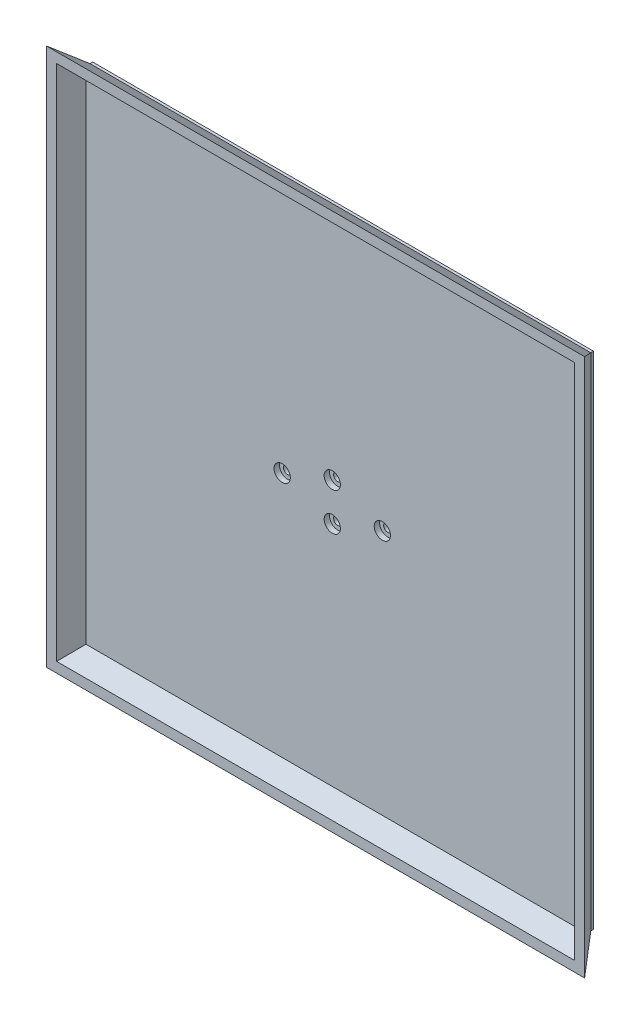
ISO-10303-21;
HEADER;
FILE_DESCRIPTION(('STEP AP214'),'2;1');
FILE_NAME('part.step','',(''),(''),'','','');
FILE_SCHEMA(('AUTOMOTIVE_DESIGN { 1 0 10303 214 1 1 1 1 }'));
ENDSEC;
DATA;
#1=APPLICATION_CONTEXT('core data for automotive mechanical design processes');
#2=APPLICATION_PROTOCOL_DEFINITION('international standard','automotive_design',2000,#1);
#3=PRODUCT_CONTEXT('',#1,'mechanical');
#4=PRODUCT('Part','Part','',(#3));
#5=PRODUCT_RELATED_PRODUCT_CATEGORY('part','',(#4));
#6=PRODUCT_DEFINITION_FORMATION('','',#4);
#7=PRODUCT_DEFINITION_CONTEXT('part definition',#1,'design');
#8=PRODUCT_DEFINITION('design','',#6,#7);
#9=PRODUCT_DEFINITION_SHAPE('','',#8);
#10=(LENGTH_UNIT() NAMED_UNIT(*) SI_UNIT(.MILLI.,.METRE.));
#11=(NAMED_UNIT(*) PLANE_ANGLE_UNIT() SI_UNIT($,.RADIAN.));
#12=(NAMED_UNIT(*) SI_UNIT($,.STERADIAN.) SOLID_ANGLE_UNIT());
#13=UNCERTAINTY_MEASURE_WITH_UNIT(LENGTH_MEASURE(1.E-05),#10,'distance_accuracy_value','');
#14=(GEOMETRIC_REPRESENTATION_CONTEXT(3) GLOBAL_UNCERTAINTY_ASSIGNED_CONTEXT((#13)) GLOBAL_UNIT_ASSIGNED_CONTEXT((#10,
#11,#12)) REPRESENTATION_CONTEXT('',''));
#15=CARTESIAN_POINT('',(0.,0.,0.));
#16=DIRECTION('',(0.,0.,1.));
#17=DIRECTION('',(1.,0.,0.));
#18=AXIS2_PLACEMENT_3D('',#15,#16,#17);
#19=CARTESIAN_POINT('',(0.,11.3214859008035,-8.36360928439204));
#20=DIRECTION('',(0.,-0.804327079908719,0.594186795987182));
#21=DIRECTION('',(0.,-0.594186795987182,-0.804327079908719));
#22=AXIS2_PLACEMENT_3D('',#19,#20,#21);
#23=PLANE('',#22);
#24=DIRECTION('',(0.515532809054974,-0.509140744837558,-0.689203616309537));
#25=VECTOR('',#24,1.);
#26=CARTESIAN_POINT('',(-32.460246779188,32.2747554652671,20.));
#27=LINE('',#26,#25);
#28=CARTESIAN_POINT('',(-24.374233395037,24.2890001362903,9.19000000000005));
#29=VERTEX_POINT('',#28);
#30=CARTESIAN_POINT('',(-17.4999999999999,17.5,0.));
#31=VERTEX_POINT('',#30);
#32=EDGE_CURVE('E187',#29,#31,#27,.T.);
#33=ORIENTED_EDGE('',*,*,#32,.F.);
#34=DIRECTION('',(1.,0.,0.));
#35=VECTOR('',#34,1.);
#36=CARTESIAN_POINT('',(0.,24.2890001362902,9.19));
#37=LINE('',#36,#35);
#38=CARTESIAN_POINT('',(174.410766604963,24.2890001362902,9.19000000000001));
#39=VERTEX_POINT('',#38);
#40=EDGE_CURVE('E528',#29,#39,#37,.T.);
#41=ORIENTED_EDGE('',*,*,#40,.T.);
#42=DIRECTION('',(-0.517540186366869,-0.508421221063519,-0.688229625537601));
#43=VECTOR('',#42,1.);
#44=CARTESIAN_POINT('',(182.539753220812,32.2747554652671,20.));
#45=LINE('',#44,#43);
#46=CARTESIAN_POINT('',(167.5,17.5,0.));
#47=VERTEX_POINT('',#46);
#48=EDGE_CURVE('E317',#39,#47,#45,.T.);
#49=ORIENTED_EDGE('',*,*,#48,.T.);
#50=DIRECTION('',(-1.,0.,0.));
#51=VECTOR('',#50,1.);
#52=CARTESIAN_POINT('',(-17.4999999999999,17.5,0.));
#53=LINE('',#52,#51);
#54=CARTESIAN_POINT('',(164.671572875254,17.5,0.));
#55=VERTEX_POINT('',#54);
#56=EDGE_CURVE('E464',#47,#55,#53,.T.);
#57=ORIENTED_EDGE('',*,*,#56,.T.);
#58=CARTESIAN_POINT('',(-14.6715728752536,17.5,0.));
#59=VERTEX_POINT('',#58);
#60=EDGE_CURVE('E410',#55,#59,#53,.T.);
#61=ORIENTED_EDGE('',*,*,#60,.T.);
#62=DIRECTION('',(-1.,0.,0.));
#63=VECTOR('',#62,1.);
#64=CARTESIAN_POINT('',(-14.6715728752538,17.5,0.));
#65=LINE('',#64,#63);
#66=EDGE_CURVE('E422',#59,#31,#65,.T.);
#67=ORIENTED_EDGE('',*,*,#66,.T.);
#68=EDGE_LOOP('',(#33,#41,#49,#57,#61,#67));
#69=FACE_BOUND('',#68,.T.);
#70=ADVANCED_FACE('F182',(#69),#23,.F.);
#71=CARTESIAN_POINT('',(-11.221383761654,0.,-8.39373351391584));
#72=DIRECTION('',(0.800763341591864,0.,0.598980860097075));
#73=DIRECTION('',(0.598980860097075,0.,-0.800763341591864));
#74=AXIS2_PLACEMENT_3D('',#71,#72,#73);
#75=PLANE('',#74);
#76=DIRECTION('',(0.,-1.,0.));
#77=VECTOR('',#76,1.);
#78=CARTESIAN_POINT('',(-24.374233395037,0.,9.19000000000001));
#79=LINE('',#78,#77);
#80=CARTESIAN_POINT('',(-24.3742333950368,-174.49599986371,9.19));
#81=VERTEX_POINT('',#80);
#82=EDGE_CURVE('E301',#29,#81,#79,.T.);
#83=ORIENTED_EDGE('',*,*,#82,.F.);
#84=ORIENTED_EDGE('',*,*,#32,.T.);
#85=DIRECTION('',(0.,-1.,0.));
#86=VECTOR('',#85,1.);
#87=CARTESIAN_POINT('',(-17.4999999999999,-167.5,0.));
#88=LINE('',#87,#86);
#89=CARTESIAN_POINT('',(-17.4999999999999,14.6715728752539,0.));
#90=VERTEX_POINT('',#89);
#91=EDGE_CURVE('E581',#31,#90,#88,.T.);
#92=ORIENTED_EDGE('',*,*,#91,.T.);
#93=CARTESIAN_POINT('',(-17.4999999999999,-164.67157287525,0.));
#94=VERTEX_POINT('',#93);
#95=EDGE_CURVE('E323',#90,#94,#88,.T.);
#96=ORIENTED_EDGE('',*,*,#95,.T.);
#97=CARTESIAN_POINT('',(-17.4999999999999,-167.5,0.));
#98=VERTEX_POINT('',#97);
#99=EDGE_CURVE('E405',#94,#98,#88,.T.);
#100=ORIENTED_EDGE('',*,*,#99,.T.);
#101=DIRECTION('',(0.511445122490861,0.520504585984007,-0.683738884845616));
#102=VECTOR('',#101,1.);
#103=CARTESIAN_POINT('',(-32.4602467791879,-182.725244534733,20.));
#104=LINE('',#103,#102);
#105=EDGE_CURVE('E321',#81,#98,#104,.T.);
#106=ORIENTED_EDGE('',*,*,#105,.F.);
#107=EDGE_LOOP('',(#83,#84,#92,#96,#100,#106));
#108=FACE_BOUND('',#107,.T.);
#109=ADVANCED_FACE('F382',(#108),#75,.F.);
#110=CARTESIAN_POINT('',(0.,-106.044862451429,-80.7279481237562));
#111=DIRECTION('',(0.,0.795678111064041,0.605719690594222));
#112=DIRECTION('',(0.,-0.605719690594222,0.795678111064041));
#113=AXIS2_PLACEMENT_3D('',#110,#111,#112);
#114=PLANE('',#113);
#115=DIRECTION('',(-1.,0.,0.));
#116=VECTOR('',#115,1.);
#117=CARTESIAN_POINT('',(0.,-174.49599986371,9.19));
#118=LINE('',#117,#116);
#119=CARTESIAN_POINT('',(174.410766604963,-174.49599986371,9.19000000000003));
#120=VERTEX_POINT('',#119);
#121=EDGE_CURVE('E526',#120,#81,#118,.T.);
#122=ORIENTED_EDGE('',*,*,#121,.T.);
#123=ORIENTED_EDGE('',*,*,#105,.T.);
#124=DIRECTION('',(1.,0.,0.));
#125=VECTOR('',#124,1.);
#126=CARTESIAN_POINT('',(-17.4999999999999,-167.5,0.));
#127=LINE('',#126,#125);
#128=CARTESIAN_POINT('',(-14.6715728752544,-167.5,0.));
#129=VERTEX_POINT('',#128);
#130=EDGE_CURVE('E193',#98,#129,#127,.T.);
#131=ORIENTED_EDGE('',*,*,#130,.T.);
#132=CARTESIAN_POINT('',(164.671572875254,-167.5,0.));
#133=VERTEX_POINT('',#132);
#134=EDGE_CURVE('E348',#129,#133,#127,.T.);
#135=ORIENTED_EDGE('',*,*,#134,.T.);
#136=DIRECTION('',(1.,0.,0.));
#137=VECTOR('',#136,1.);
#138=CARTESIAN_POINT('',(164.671572875254,-167.5,0.));
#139=LINE('',#138,#137);
#140=CARTESIAN_POINT('',(167.5,-167.5,0.));
#141=VERTEX_POINT('',#140);
#142=EDGE_CURVE('E353',#133,#141,#139,.T.);
#143=ORIENTED_EDGE('',*,*,#142,.T.);
#144=DIRECTION('',(-0.513448036426631,0.51978059717471,-0.682787847497552));
#145=VECTOR('',#144,1.);
#146=CARTESIAN_POINT('',(182.539753220812,-182.725244534733,20.));
#147=LINE('',#146,#145);
#148=EDGE_CURVE('E320',#120,#141,#147,.T.);
#149=ORIENTED_EDGE('',*,*,#148,.F.);
#150=EDGE_LOOP('',(#122,#123,#131,#135,#143,#149));
#151=FACE_BOUND('',#150,.T.);
#152=ADVANCED_FACE('F184',(#151),#114,.F.);
#153=CARTESIAN_POINT('',(0.,-103.657828118237,-78.9107890519735));
#154=DIRECTION('',(0.,0.795678111064041,0.605719690594222));
#155=DIRECTION('',(0.,-0.605719690594222,0.795678111064041));
#156=AXIS2_PLACEMENT_3D('',#153,#154,#155);
#157=PLANE('',#156);
#158=DIRECTION('',(0.51144512249086,0.520504585984007,-0.683738884845616));
#159=VECTOR('',#158,1.);
#160=CARTESIAN_POINT('',(33.4304203031569,-115.709844169123,-63.0791667441771));
#161=LINE('',#160,#159);
#162=CARTESIAN_POINT('',(-20.6278081478019,-170.725630969198,9.19000000000001));
#163=VERTEX_POINT('',#162);
#164=CARTESIAN_POINT('',(-15.9976117696432,-166.013417785698,3.));
#165=VERTEX_POINT('',#164);
#166=EDGE_CURVE('E209',#163,#165,#161,.T.);
#167=ORIENTED_EDGE('',*,*,#166,.F.);
#168=DIRECTION('',(-1.,0.,0.));
#169=VECTOR('',#168,1.);
#170=CARTESIAN_POINT('',(0.,-170.725630969198,9.19));
#171=LINE('',#170,#169);
#172=CARTESIAN_POINT('',(170.657185783772,-170.725630969198,9.19000000000002));
#173=VERTEX_POINT('',#172);
#174=EDGE_CURVE('E300',#173,#163,#171,.T.);
#175=ORIENTED_EDGE('',*,*,#174,.F.);
#176=DIRECTION('',(-0.513448036426631,0.51978059717471,-0.682787847497552));
#177=VECTOR('',#176,1.);
#178=CARTESIAN_POINT('',(76.8819155984242,-75.7937927321945,-115.513203315306));
#179=LINE('',#178,#177);
#180=CARTESIAN_POINT('',(166.002382161931,-166.013417785698,3.));
#181=VERTEX_POINT('',#180);
#182=EDGE_CURVE('E201',#173,#181,#179,.T.);
#183=ORIENTED_EDGE('',*,*,#182,.T.);
#184=DIRECTION('',(1.,0.,0.));
#185=VECTOR('',#184,1.);
#186=CARTESIAN_POINT('',(0.,-166.013417785698,3.));
#187=LINE('',#186,#185);
#188=EDGE_CURVE('E319',#165,#181,#187,.T.);
#189=ORIENTED_EDGE('',*,*,#188,.F.);
#190=EDGE_LOOP('',(#167,#175,#183,#189));
#191=FACE_BOUND('',#190,.T.);
#192=ADVANCED_FACE('F622',(#191),#157,.T.);
#193=CARTESIAN_POINT('',(-8.81909373687842,0.,-6.59679093362462));
#194=DIRECTION('',(0.800763341591864,0.,0.598980860097075));
#195=DIRECTION('',(0.598980860097075,0.,-0.800763341591864));
#196=AXIS2_PLACEMENT_3D('',#193,#194,#195);
#197=PLANE('',#196);
#198=DIRECTION('',(0.515532809054974,-0.509140744837558,-0.689203616309537));
#199=VECTOR('',#198,1.);
#200=CARTESIAN_POINT('',(-6.48385292214424,6.59058913702638,-9.71871913334237));
#201=LINE('',#200,#199);
#202=CARTESIAN_POINT('',(-20.627808147802,20.5591742048539,9.19000000000001));
#203=VERTEX_POINT('',#202);
#204=CARTESIAN_POINT('',(-15.9976117696433,15.9863873883537,3.));
#205=VERTEX_POINT('',#204);
#206=EDGE_CURVE('E292',#203,#205,#201,.T.);
#207=ORIENTED_EDGE('',*,*,#206,.F.);
#208=DIRECTION('',(0.,-1.,0.));
#209=VECTOR('',#208,1.);
#210=CARTESIAN_POINT('',(-20.627808147802,0.,9.19000000000001));
#211=LINE('',#210,#209);
#212=EDGE_CURVE('E297',#203,#163,#211,.T.);
#213=ORIENTED_EDGE('',*,*,#212,.T.);
#214=ORIENTED_EDGE('',*,*,#166,.T.);
#215=DIRECTION('',(0.,-1.,0.));
#216=VECTOR('',#215,1.);
#217=CARTESIAN_POINT('',(-15.9976117696433,0.,3.));
#218=LINE('',#217,#216);
#219=EDGE_CURVE('E305',#205,#165,#218,.T.);
#220=ORIENTED_EDGE('',*,*,#219,.F.);
#221=EDGE_LOOP('',(#207,#213,#214,#220));
#222=FACE_BOUND('',#221,.T.);
#223=ADVANCED_FACE('F303',(#222),#197,.T.);
#224=CARTESIAN_POINT('',(0.,8.90850466107736,-6.58104889643049));
#225=DIRECTION('',(0.,-0.804327079908719,0.594186795987182));
#226=DIRECTION('',(0.,-0.594186795987182,-0.804327079908719));
#227=AXIS2_PLACEMENT_3D('',#224,#225,#226);
#228=PLANE('',#227);
#229=DIRECTION('',(1.,0.,0.));
#230=VECTOR('',#229,1.);
#231=CARTESIAN_POINT('',(0.,20.5591742048539,9.19));
#232=LINE('',#231,#230);
#233=CARTESIAN_POINT('',(170.657185783772,20.5591742048539,9.19));
#234=VERTEX_POINT('',#233);
#235=EDGE_CURVE('E12',#203,#234,#232,.T.);
#236=ORIENTED_EDGE('',*,*,#235,.F.);
#237=ORIENTED_EDGE('',*,*,#206,.T.);
#238=DIRECTION('',(-1.,0.,0.));
#239=VECTOR('',#238,1.);
#240=CARTESIAN_POINT('',(0.,15.9863873883537,3.));
#241=LINE('',#240,#239);
#242=CARTESIAN_POINT('',(166.002382161931,15.9863873883537,3.));
#243=VERTEX_POINT('',#242);
#244=EDGE_CURVE('E509',#243,#205,#241,.T.);
#245=ORIENTED_EDGE('',*,*,#244,.F.);
#246=DIRECTION('',(-0.517540186366869,-0.508421221063519,-0.688229625537601));
#247=VECTOR('',#246,1.);
#248=CARTESIAN_POINT('',(116.263969700101,-32.8756431626005,-63.1425912135338));
#249=LINE('',#248,#247);
#250=EDGE_CURVE('E294',#234,#243,#249,.T.);
#251=ORIENTED_EDGE('',*,*,#250,.F.);
#252=EDGE_LOOP('',(#236,#237,#245,#251));
#253=FACE_BOUND('',#252,.T.);
#254=ADVANCED_FACE('F289',(#253),#228,.T.);
#255=CARTESIAN_POINT('',(56.5,-75.,9.));
#256=DIRECTION('',(0.,0.,-1.));
#257=DIRECTION('',(-1.,0.,0.));
#258=AXIS2_PLACEMENT_3D('',#255,#256,#257);
#259=CYLINDRICAL_SURFACE('',#258,1.51);
#260=CARTESIAN_POINT('',(56.5,-75.,-1.));
#261=DIRECTION('',(0.,0.,-1.));
#262=DIRECTION('',(-1.,0.,0.));
#263=AXIS2_PLACEMENT_3D('',#260,#261,#262);
#264=CIRCLE('',#263,1.51);
#265=CARTESIAN_POINT('',(54.99,-75.,-1.));
#266=VERTEX_POINT('',#265);
#267=EDGE_CURVE('E483',#266,#266,#264,.T.);
#268=ORIENTED_EDGE('',*,*,#267,.T.);
#269=EDGE_LOOP('',(#268));
#270=FACE_BOUND('',#269,.T.);
#271=CARTESIAN_POINT('',(56.5,-75.,1.));
#272=DIRECTION('',(0.,0.,1.));
#273=DIRECTION('',(1.,0.,0.));
#274=AXIS2_PLACEMENT_3D('',#271,#272,#273);
#275=CIRCLE('',#274,1.51);
#276=CARTESIAN_POINT('',(58.01,-75.,1.));
#277=VERTEX_POINT('',#276);
#278=EDGE_CURVE('E481',#277,#277,#275,.F.);
#279=ORIENTED_EDGE('',*,*,#278,.F.);
#280=EDGE_LOOP('',(#279));
#281=FACE_BOUND('',#280,.T.);
#282=ADVANCED_FACE('F661',(#270,#281),#259,.F.);
#283=CARTESIAN_POINT('',(75.,-82.,9.));
#284=DIRECTION('',(0.,0.,-1.));
#285=DIRECTION('',(-1.,0.,0.));
#286=AXIS2_PLACEMENT_3D('',#283,#284,#285);
#287=CYLINDRICAL_SURFACE('',#286,1.50999999999999);
#288=CARTESIAN_POINT('',(75.,-82.,-1.));
#289=DIRECTION('',(0.,0.,-1.));
#290=DIRECTION('',(-1.,0.,0.));
#291=AXIS2_PLACEMENT_3D('',#288,#289,#290);
#292=CIRCLE('',#291,1.50999999999999);
#293=CARTESIAN_POINT('',(73.49,-82.,-1.));
#294=VERTEX_POINT('',#293);
#295=EDGE_CURVE('E487',#294,#294,#292,.T.);
#296=ORIENTED_EDGE('',*,*,#295,.T.);
#297=EDGE_LOOP('',(#296));
#298=FACE_BOUND('',#297,.T.);
#299=CARTESIAN_POINT('',(75.,-82.,1.));
#300=DIRECTION('',(0.,0.,1.));
#301=DIRECTION('',(1.,0.,0.));
#302=AXIS2_PLACEMENT_3D('',#299,#300,#301);
#303=CIRCLE('',#302,1.50999999999999);
#304=CARTESIAN_POINT('',(76.51,-82.,1.));
#305=VERTEX_POINT('',#304);
#306=EDGE_CURVE('E478',#305,#305,#303,.F.);
#307=ORIENTED_EDGE('',*,*,#306,.F.);
#308=EDGE_LOOP('',(#307));
#309=FACE_BOUND('',#308,.T.);
#310=ADVANCED_FACE('F791',(#298,#309),#287,.F.);
#311=CARTESIAN_POINT('',(75.,-68.,9.));
#312=DIRECTION('',(0.,0.,-1.));
#313=DIRECTION('',(-1.,0.,0.));
#314=AXIS2_PLACEMENT_3D('',#311,#312,#313);
#315=CYLINDRICAL_SURFACE('',#314,1.50999999999999);
#316=CARTESIAN_POINT('',(75.,-68.,-1.));
#317=DIRECTION('',(0.,0.,-1.));
#318=DIRECTION('',(-1.,0.,0.));
#319=AXIS2_PLACEMENT_3D('',#316,#317,#318);
#320=CIRCLE('',#319,1.50999999999999);
#321=CARTESIAN_POINT('',(73.49,-68.,-1.));
#322=VERTEX_POINT('',#321);
#323=EDGE_CURVE('E492',#322,#322,#320,.T.);
#324=ORIENTED_EDGE('',*,*,#323,.T.);
#325=EDGE_LOOP('',(#324));
#326=FACE_BOUND('',#325,.T.);
#327=CARTESIAN_POINT('',(75.,-68.,1.));
#328=DIRECTION('',(0.,0.,1.));
#329=DIRECTION('',(1.,0.,0.));
#330=AXIS2_PLACEMENT_3D('',#327,#328,#329);
#331=CIRCLE('',#330,1.50999999999999);
#332=CARTESIAN_POINT('',(76.51,-68.,1.));
#333=VERTEX_POINT('',#332);
#334=EDGE_CURVE('E474',#333,#333,#331,.F.);
#335=ORIENTED_EDGE('',*,*,#334,.F.);
#336=EDGE_LOOP('',(#335));
#337=FACE_BOUND('',#336,.T.);
#338=ADVANCED_FACE('F558',(#326,#337),#315,.F.);
#339=CARTESIAN_POINT('',(93.5,-75.,9.));
#340=DIRECTION('',(0.,0.,-1.));
#341=DIRECTION('',(-1.,0.,0.));
#342=AXIS2_PLACEMENT_3D('',#339,#340,#341);
#343=CYLINDRICAL_SURFACE('',#342,1.50999999999999);
#344=CARTESIAN_POINT('',(93.5,-75.,-1.));
#345=DIRECTION('',(0.,0.,-1.));
#346=DIRECTION('',(-1.,0.,0.));
#347=AXIS2_PLACEMENT_3D('',#344,#345,#346);
#348=CIRCLE('',#347,1.50999999999999);
#349=CARTESIAN_POINT('',(91.99,-75.,-1.));
#350=VERTEX_POINT('',#349);
#351=EDGE_CURVE('E500',#350,#350,#348,.T.);
#352=ORIENTED_EDGE('',*,*,#351,.T.);
#353=EDGE_LOOP('',(#352));
#354=FACE_BOUND('',#353,.T.);
#355=CARTESIAN_POINT('',(93.5,-75.,1.));
#356=DIRECTION('',(0.,0.,1.));
#357=DIRECTION('',(1.,0.,0.));
#358=AXIS2_PLACEMENT_3D('',#355,#356,#357);
#359=CIRCLE('',#358,1.50999999999999);
#360=CARTESIAN_POINT('',(95.01,-75.,1.));
#361=VERTEX_POINT('',#360);
#362=EDGE_CURVE('E471',#361,#361,#359,.F.);
#363=ORIENTED_EDGE('',*,*,#362,.F.);
#364=EDGE_LOOP('',(#363));
#365=FACE_BOUND('',#364,.T.);
#366=ADVANCED_FACE('F381',(#354,#365),#343,.F.);
#367=CARTESIAN_POINT('',(106.995565380524,0.,-80.4593449522167));
#368=DIRECTION('',(-0.799236820228583,0.,0.601016227061219));
#369=DIRECTION('',(0.601016227061219,0.,0.799236820228583));
#370=AXIS2_PLACEMENT_3D('',#367,#368,#369);
#371=PLANE('',#370);
#372=ORIENTED_EDGE('',*,*,#48,.F.);
#373=DIRECTION('',(0.,-1.,0.));
#374=VECTOR('',#373,1.);
#375=CARTESIAN_POINT('',(174.410766604963,1.37354571998003E-13,9.19));
#376=LINE('',#375,#374);
#377=EDGE_CURVE('E519',#39,#120,#376,.T.);
#378=ORIENTED_EDGE('',*,*,#377,.T.);
#379=ORIENTED_EDGE('',*,*,#148,.T.);
#380=DIRECTION('',(0.,1.,0.));
#381=VECTOR('',#380,1.);
#382=CARTESIAN_POINT('',(167.5,-167.5,0.));
#383=LINE('',#382,#381);
#384=CARTESIAN_POINT('',(167.5,-164.671572875254,0.));
#385=VERTEX_POINT('',#384);
#386=EDGE_CURVE('E589',#141,#385,#383,.T.);
#387=ORIENTED_EDGE('',*,*,#386,.T.);
#388=CARTESIAN_POINT('',(167.5,14.6715728752538,0.));
#389=VERTEX_POINT('',#388);
#390=EDGE_CURVE('E360',#385,#389,#383,.T.);
#391=ORIENTED_EDGE('',*,*,#390,.T.);
#392=EDGE_CURVE('E308',#389,#47,#383,.T.);
#393=ORIENTED_EDGE('',*,*,#392,.T.);
#394=EDGE_LOOP('',(#372,#378,#379,#387,#391,#393));
#395=FACE_BOUND('',#394,.T.);
#396=ADVANCED_FACE('F371',(#395),#371,.F.);
#397=CARTESIAN_POINT('',(0.,0.,3.));
#398=DIRECTION('',(0.,0.,-1.));
#399=DIRECTION('',(-1.,0.,0.));
#400=AXIS2_PLACEMENT_3D('',#397,#398,#399);
#401=PLANE('',#400);
#402=CARTESIAN_POINT('',(75.,-68.,3.));
#403=DIRECTION('',(0.,0.,1.));
#404=DIRECTION('',(1.,0.,0.));
#405=AXIS2_PLACEMENT_3D('',#402,#403,#404);
#406=CIRCLE('',#405,3.00000000000001);
#407=CARTESIAN_POINT('',(78.,-68.,3.));
#408=VERTEX_POINT('',#407);
#409=EDGE_CURVE('E534',#408,#408,#406,.T.);
#410=ORIENTED_EDGE('',*,*,#409,.F.);
#411=EDGE_LOOP('',(#410));
#412=FACE_BOUND('',#411,.T.);
#413=CARTESIAN_POINT('',(75.,-82.,3.));
#414=DIRECTION('',(0.,0.,1.));
#415=DIRECTION('',(1.,0.,0.));
#416=AXIS2_PLACEMENT_3D('',#413,#414,#415);
#417=CIRCLE('',#416,3.00000000000001);
#418=CARTESIAN_POINT('',(78.,-82.,3.));
#419=VERTEX_POINT('',#418);
#420=EDGE_CURVE('E540',#419,#419,#417,.T.);
#421=ORIENTED_EDGE('',*,*,#420,.F.);
#422=EDGE_LOOP('',(#421));
#423=FACE_BOUND('',#422,.T.);
#424=CARTESIAN_POINT('',(93.5,-75.,3.));
#425=DIRECTION('',(0.,0.,1.));
#426=DIRECTION('',(1.,0.,0.));
#427=AXIS2_PLACEMENT_3D('',#424,#425,#426);
#428=CIRCLE('',#427,3.00000000000001);
#429=CARTESIAN_POINT('',(96.5,-75.,3.));
#430=VERTEX_POINT('',#429);
#431=EDGE_CURVE('E546',#430,#430,#428,.T.);
#432=ORIENTED_EDGE('',*,*,#431,.F.);
#433=EDGE_LOOP('',(#432));
#434=FACE_BOUND('',#433,.T.);
#435=CARTESIAN_POINT('',(56.5,-75.,3.));
#436=DIRECTION('',(0.,0.,1.));
#437=DIRECTION('',(1.,0.,0.));
#438=AXIS2_PLACEMENT_3D('',#435,#436,#437);
#439=CIRCLE('',#438,3.);
#440=CARTESIAN_POINT('',(59.5,-75.,3.));
#441=VERTEX_POINT('',#440);
#442=EDGE_CURVE('E531',#441,#441,#439,.T.);
#443=ORIENTED_EDGE('',*,*,#442,.F.);
#444=EDGE_LOOP('',(#443));
#445=FACE_BOUND('',#444,.T.);
#446=ORIENTED_EDGE('',*,*,#219,.T.);
#447=ORIENTED_EDGE('',*,*,#188,.T.);
#448=DIRECTION('',(0.,1.,0.));
#449=VECTOR('',#448,1.);
#450=CARTESIAN_POINT('',(166.002382161931,1.30732675489841E-13,3.));
#451=LINE('',#450,#449);
#452=EDGE_CURVE('E511',#181,#243,#451,.T.);
#453=ORIENTED_EDGE('',*,*,#452,.T.);
#454=ORIENTED_EDGE('',*,*,#244,.T.);
#455=EDGE_LOOP('',(#446,#447,#453,#454));
#456=FACE_BOUND('',#455,.T.);
#457=ADVANCED_FACE('F380',(#412,#423,#434,#445,#456),#401,.F.);
#458=CARTESIAN_POINT('',(104.597854919838,0.,-78.6562962710331));
#459=DIRECTION('',(-0.799236820228583,0.,0.601016227061219));
#460=DIRECTION('',(0.601016227061219,0.,0.799236820228583));
#461=AXIS2_PLACEMENT_3D('',#458,#459,#460);
#462=PLANE('',#461);
#463=DIRECTION('',(0.,-1.,0.));
#464=VECTOR('',#463,1.);
#465=CARTESIAN_POINT('',(170.657185783772,1.3439849596445E-13,9.19));
#466=LINE('',#465,#464);
#467=EDGE_CURVE('E517',#234,#173,#466,.T.);
#468=ORIENTED_EDGE('',*,*,#467,.F.);
#469=ORIENTED_EDGE('',*,*,#250,.T.);
#470=ORIENTED_EDGE('',*,*,#452,.F.);
#471=ORIENTED_EDGE('',*,*,#182,.F.);
#472=EDGE_LOOP('',(#468,#469,#470,#471));
#473=FACE_BOUND('',#472,.T.);
#474=ADVANCED_FACE('F516',(#473),#462,.T.);
#475=CARTESIAN_POINT('',(0.,0.,-1.));
#476=DIRECTION('',(0.,0.,-1.));
#477=DIRECTION('',(-1.,0.,0.));
#478=AXIS2_PLACEMENT_3D('',#475,#476,#477);
#479=PLANE('',#478);
#480=ORIENTED_EDGE('',*,*,#351,.F.);
#481=EDGE_LOOP('',(#480));
#482=FACE_BOUND('',#481,.T.);
#483=ORIENTED_EDGE('',*,*,#323,.F.);
#484=EDGE_LOOP('',(#483));
#485=FACE_BOUND('',#484,.T.);
#486=ORIENTED_EDGE('',*,*,#295,.F.);
#487=EDGE_LOOP('',(#486));
#488=FACE_BOUND('',#487,.T.);
#489=ORIENTED_EDGE('',*,*,#267,.F.);
#490=EDGE_LOOP('',(#489));
#491=FACE_BOUND('',#490,.T.);
#492=DIRECTION('',(1.,0.,0.));
#493=VECTOR('',#492,1.);
#494=CARTESIAN_POINT('',(-17.4999999999999,-167.5,-1.));
#495=LINE('',#494,#493);
#496=CARTESIAN_POINT('',(-17.4999999999999,-167.5,-1.));
#497=VERTEX_POINT('',#496);
#498=CARTESIAN_POINT('',(167.5,-167.5,-1.));
#499=VERTEX_POINT('',#498);
#500=EDGE_CURVE('E496',#497,#499,#495,.T.);
#501=ORIENTED_EDGE('',*,*,#500,.F.);
#502=DIRECTION('',(0.,-1.,0.));
#503=VECTOR('',#502,1.);
#504=CARTESIAN_POINT('',(-17.4999999999999,17.5,-1.));
#505=LINE('',#504,#503);
#506=CARTESIAN_POINT('',(-17.4999999999999,17.5,-1.));
#507=VERTEX_POINT('',#506);
#508=EDGE_CURVE('E504',#507,#497,#505,.T.);
#509=ORIENTED_EDGE('',*,*,#508,.F.);
#510=DIRECTION('',(1.,0.,0.));
#511=VECTOR('',#510,1.);
#512=CARTESIAN_POINT('',(-17.4999999999999,17.5,-1.));
#513=LINE('',#512,#511);
#514=CARTESIAN_POINT('',(167.5,17.5,-1.));
#515=VERTEX_POINT('',#514);
#516=EDGE_CURVE('E502',#507,#515,#513,.T.);
#517=ORIENTED_EDGE('',*,*,#516,.T.);
#518=DIRECTION('',(0.,-1.,0.));
#519=VECTOR('',#518,1.);
#520=CARTESIAN_POINT('',(167.5,17.5,-1.));
#521=LINE('',#520,#519);
#522=EDGE_CURVE('E499',#515,#499,#521,.T.);
#523=ORIENTED_EDGE('',*,*,#522,.T.);
#524=EDGE_LOOP('',(#501,#509,#517,#523));
#525=FACE_BOUND('',#524,.T.);
#526=ADVANCED_FACE('F561',(#482,#485,#488,#491,#525),#479,.T.);
#527=CARTESIAN_POINT('',(-17.4999999999999,-167.5,-1.));
#528=DIRECTION('',(0.,-1.,0.));
#529=DIRECTION('',(0.,0.,-1.));
#530=AXIS2_PLACEMENT_3D('',#527,#528,#529);
#531=PLANE('',#530);
#532=ORIENTED_EDGE('',*,*,#130,.F.);
#533=DIRECTION('',(0.,0.,1.));
#534=VECTOR('',#533,1.);
#535=CARTESIAN_POINT('',(-17.4999999999999,-167.5,-1.));
#536=LINE('',#535,#534);
#537=EDGE_CURVE('E430',#497,#98,#536,.T.);
#538=ORIENTED_EDGE('',*,*,#537,.F.);
#539=ORIENTED_EDGE('',*,*,#500,.T.);
#540=DIRECTION('',(0.,0.,1.));
#541=VECTOR('',#540,1.);
#542=CARTESIAN_POINT('',(167.5,-167.5,-1.));
#543=LINE('',#542,#541);
#544=EDGE_CURVE('E507',#499,#141,#543,.T.);
#545=ORIENTED_EDGE('',*,*,#544,.T.);
#546=ORIENTED_EDGE('',*,*,#142,.F.);
#547=ORIENTED_EDGE('',*,*,#134,.F.);
#548=EDGE_LOOP('',(#532,#538,#539,#545,#546,#547));
#549=FACE_BOUND('',#548,.T.);
#550=ADVANCED_FACE('F564',(#549),#531,.T.);
#551=CARTESIAN_POINT('',(-17.4999999999999,17.5,-1.));
#552=DIRECTION('',(-1.,0.,0.));
#553=DIRECTION('',(0.,0.,1.));
#554=AXIS2_PLACEMENT_3D('',#551,#552,#553);
#555=PLANE('',#554);
#556=ORIENTED_EDGE('',*,*,#91,.F.);
#557=DIRECTION('',(0.,0.,1.));
#558=VECTOR('',#557,1.);
#559=CARTESIAN_POINT('',(-17.4999999999999,17.5,-1.));
#560=LINE('',#559,#558);
#561=EDGE_CURVE('E579',#507,#31,#560,.T.);
#562=ORIENTED_EDGE('',*,*,#561,.F.);
#563=ORIENTED_EDGE('',*,*,#508,.T.);
#564=ORIENTED_EDGE('',*,*,#537,.T.);
#565=ORIENTED_EDGE('',*,*,#99,.F.);
#566=ORIENTED_EDGE('',*,*,#95,.F.);
#567=EDGE_LOOP('',(#556,#562,#563,#564,#565,#566));
#568=FACE_BOUND('',#567,.T.);
#569=ADVANCED_FACE('F453',(#568),#555,.T.);
#570=CARTESIAN_POINT('',(-17.4999999999999,17.5,-1.));
#571=DIRECTION('',(0.,-1.,0.));
#572=DIRECTION('',(0.,0.,-1.));
#573=AXIS2_PLACEMENT_3D('',#570,#571,#572);
#574=PLANE('',#573);
#575=ORIENTED_EDGE('',*,*,#66,.F.);
#576=ORIENTED_EDGE('',*,*,#60,.F.);
#577=ORIENTED_EDGE('',*,*,#56,.F.);
#578=DIRECTION('',(0.,0.,1.));
#579=VECTOR('',#578,1.);
#580=CARTESIAN_POINT('',(167.5,17.5,-1.));
#581=LINE('',#580,#579);
#582=EDGE_CURVE('E583',#515,#47,#581,.T.);
#583=ORIENTED_EDGE('',*,*,#582,.F.);
#584=ORIENTED_EDGE('',*,*,#516,.F.);
#585=ORIENTED_EDGE('',*,*,#561,.T.);
#586=EDGE_LOOP('',(#575,#576,#577,#583,#584,#585));
#587=FACE_BOUND('',#586,.T.);
#588=ADVANCED_FACE('F442',(#587),#574,.F.);
#589=CARTESIAN_POINT('',(167.5,17.5,-1.));
#590=DIRECTION('',(-1.,0.,0.));
#591=DIRECTION('',(0.,0.,1.));
#592=AXIS2_PLACEMENT_3D('',#589,#590,#591);
#593=PLANE('',#592);
#594=ORIENTED_EDGE('',*,*,#392,.F.);
#595=ORIENTED_EDGE('',*,*,#390,.F.);
#596=ORIENTED_EDGE('',*,*,#386,.F.);
#597=ORIENTED_EDGE('',*,*,#544,.F.);
#598=ORIENTED_EDGE('',*,*,#522,.F.);
#599=ORIENTED_EDGE('',*,*,#582,.T.);
#600=EDGE_LOOP('',(#594,#595,#596,#597,#598,#599));
#601=FACE_BOUND('',#600,.T.);
#602=ADVANCED_FACE('F452',(#601),#593,.F.);
#603=CARTESIAN_POINT('',(93.5,-75.,1.));
#604=DIRECTION('',(0.,0.,1.));
#605=DIRECTION('',(1.,0.,0.));
#606=AXIS2_PLACEMENT_3D('',#603,#604,#605);
#607=PLANE('',#606);
#608=CARTESIAN_POINT('',(93.5,-75.,1.));
#609=DIRECTION('',(0.,0.,1.));
#610=DIRECTION('',(1.,0.,0.));
#611=AXIS2_PLACEMENT_3D('',#608,#609,#610);
#612=CIRCLE('',#611,3.00000000000001);
#613=CARTESIAN_POINT('',(96.5,-75.,1.));
#614=VERTEX_POINT('',#613);
#615=EDGE_CURVE('E543',#614,#614,#612,.T.);
#616=ORIENTED_EDGE('',*,*,#615,.T.);
#617=EDGE_LOOP('',(#616));
#618=FACE_BOUND('',#617,.T.);
#619=ORIENTED_EDGE('',*,*,#362,.T.);
#620=EDGE_LOOP('',(#619));
#621=FACE_BOUND('',#620,.T.);
#622=ADVANCED_FACE('F730',(#618,#621),#607,.T.);
#623=CARTESIAN_POINT('',(93.5,-75.,1.));
#624=DIRECTION('',(0.,0.,1.));
#625=DIRECTION('',(1.,0.,0.));
#626=AXIS2_PLACEMENT_3D('',#623,#624,#625);
#627=CYLINDRICAL_SURFACE('',#626,3.00000000000001);
#628=ORIENTED_EDGE('',*,*,#615,.F.);
#629=EDGE_LOOP('',(#628));
#630=FACE_BOUND('',#629,.T.);
#631=ORIENTED_EDGE('',*,*,#431,.T.);
#632=EDGE_LOOP('',(#631));
#633=FACE_BOUND('',#632,.T.);
#634=ADVANCED_FACE('F722',(#630,#633),#627,.F.);
#635=CARTESIAN_POINT('',(75.,-68.,1.));
#636=DIRECTION('',(0.,0.,1.));
#637=DIRECTION('',(1.,0.,0.));
#638=AXIS2_PLACEMENT_3D('',#635,#636,#637);
#639=PLANE('',#638);
#640=CARTESIAN_POINT('',(75.,-68.,1.));
#641=DIRECTION('',(0.,0.,1.));
#642=DIRECTION('',(1.,0.,0.));
#643=AXIS2_PLACEMENT_3D('',#640,#641,#642);
#644=CIRCLE('',#643,3.00000000000001);
#645=CARTESIAN_POINT('',(78.,-68.,1.));
#646=VERTEX_POINT('',#645);
#647=EDGE_CURVE('E475',#646,#646,#644,.T.);
#648=ORIENTED_EDGE('',*,*,#647,.T.);
#649=EDGE_LOOP('',(#648));
#650=FACE_BOUND('',#649,.T.);
#651=ORIENTED_EDGE('',*,*,#334,.T.);
#652=EDGE_LOOP('',(#651));
#653=FACE_BOUND('',#652,.T.);
#654=ADVANCED_FACE('F714',(#650,#653),#639,.T.);
#655=CARTESIAN_POINT('',(75.,-68.,1.));
#656=DIRECTION('',(0.,0.,1.));
#657=DIRECTION('',(1.,0.,0.));
#658=AXIS2_PLACEMENT_3D('',#655,#656,#657);
#659=CYLINDRICAL_SURFACE('',#658,3.00000000000001);
#660=ORIENTED_EDGE('',*,*,#647,.F.);
#661=EDGE_LOOP('',(#660));
#662=FACE_BOUND('',#661,.T.);
#663=ORIENTED_EDGE('',*,*,#409,.T.);
#664=EDGE_LOOP('',(#663));
#665=FACE_BOUND('',#664,.T.);
#666=ADVANCED_FACE('F706',(#662,#665),#659,.F.);
#667=CARTESIAN_POINT('',(75.,-82.,1.));
#668=DIRECTION('',(0.,0.,1.));
#669=DIRECTION('',(1.,0.,0.));
#670=AXIS2_PLACEMENT_3D('',#667,#668,#669);
#671=PLANE('',#670);
#672=CARTESIAN_POINT('',(75.,-82.,1.));
#673=DIRECTION('',(0.,0.,1.));
#674=DIRECTION('',(1.,0.,0.));
#675=AXIS2_PLACEMENT_3D('',#672,#673,#674);
#676=CIRCLE('',#675,3.00000000000001);
#677=CARTESIAN_POINT('',(78.,-82.,1.));
#678=VERTEX_POINT('',#677);
#679=EDGE_CURVE('E537',#678,#678,#676,.T.);
#680=ORIENTED_EDGE('',*,*,#679,.T.);
#681=EDGE_LOOP('',(#680));
#682=FACE_BOUND('',#681,.T.);
#683=ORIENTED_EDGE('',*,*,#306,.T.);
#684=EDGE_LOOP('',(#683));
#685=FACE_BOUND('',#684,.T.);
#686=ADVANCED_FACE('F698',(#682,#685),#671,.T.);
#687=CARTESIAN_POINT('',(75.,-82.,1.));
#688=DIRECTION('',(0.,0.,1.));
#689=DIRECTION('',(1.,0.,0.));
#690=AXIS2_PLACEMENT_3D('',#687,#688,#689);
#691=CYLINDRICAL_SURFACE('',#690,3.00000000000001);
#692=ORIENTED_EDGE('',*,*,#679,.F.);
#693=EDGE_LOOP('',(#692));
#694=FACE_BOUND('',#693,.T.);
#695=ORIENTED_EDGE('',*,*,#420,.T.);
#696=EDGE_LOOP('',(#695));
#697=FACE_BOUND('',#696,.T.);
#698=ADVANCED_FACE('F690',(#694,#697),#691,.F.);
#699=CARTESIAN_POINT('',(56.5,-75.,1.));
#700=DIRECTION('',(0.,0.,1.));
#701=DIRECTION('',(1.,0.,0.));
#702=AXIS2_PLACEMENT_3D('',#699,#700,#701);
#703=PLANE('',#702);
#704=CARTESIAN_POINT('',(56.5,-75.,1.));
#705=DIRECTION('',(0.,0.,1.));
#706=DIRECTION('',(1.,0.,0.));
#707=AXIS2_PLACEMENT_3D('',#704,#705,#706);
#708=CIRCLE('',#707,3.);
#709=CARTESIAN_POINT('',(59.5,-75.,1.));
#710=VERTEX_POINT('',#709);
#711=EDGE_CURVE('E549',#710,#710,#708,.T.);
#712=ORIENTED_EDGE('',*,*,#711,.T.);
#713=EDGE_LOOP('',(#712));
#714=FACE_BOUND('',#713,.T.);
#715=ORIENTED_EDGE('',*,*,#278,.T.);
#716=EDGE_LOOP('',(#715));
#717=FACE_BOUND('',#716,.T.);
#718=ADVANCED_FACE('F681',(#714,#717),#703,.T.);
#719=CARTESIAN_POINT('',(56.5,-75.,1.));
#720=DIRECTION('',(0.,0.,1.));
#721=DIRECTION('',(1.,0.,0.));
#722=AXIS2_PLACEMENT_3D('',#719,#720,#721);
#723=CYLINDRICAL_SURFACE('',#722,3.);
#724=ORIENTED_EDGE('',*,*,#711,.F.);
#725=EDGE_LOOP('',(#724));
#726=FACE_BOUND('',#725,.T.);
#727=ORIENTED_EDGE('',*,*,#442,.T.);
#728=EDGE_LOOP('',(#727));
#729=FACE_BOUND('',#728,.T.);
#730=ADVANCED_FACE('F671',(#726,#729),#723,.F.);
#731=CARTESIAN_POINT('',(182.5,0.,9.19));
#732=DIRECTION('',(0.,0.,-1.));
#733=DIRECTION('',(-1.,0.,0.));
#734=AXIS2_PLACEMENT_3D('',#731,#732,#733);
#735=PLANE('',#734);
#736=ORIENTED_EDGE('',*,*,#212,.F.);
#737=ORIENTED_EDGE('',*,*,#235,.T.);
#738=ORIENTED_EDGE('',*,*,#467,.T.);
#739=ORIENTED_EDGE('',*,*,#174,.T.);
#740=EDGE_LOOP('',(#736,#737,#738,#739));
#741=FACE_BOUND('',#740,.T.);
#742=ORIENTED_EDGE('',*,*,#40,.F.);
#743=ORIENTED_EDGE('',*,*,#82,.T.);
#744=ORIENTED_EDGE('',*,*,#121,.F.);
#745=ORIENTED_EDGE('',*,*,#377,.F.);
#746=EDGE_LOOP('',(#742,#743,#744,#745));
#747=FACE_BOUND('',#746,.T.);
#748=ADVANCED_FACE('F298',(#741,#747),#735,.F.);
#749=CLOSED_SHELL('',(#70,#109,#152,#192,#223,#254,#282,#310,#338,#366,#396,#457,#474,#526,#550,
#569,#588,#602,#622,#634,#654,#666,#686,#698,#718,#730,#748));
#750=MANIFOLD_SOLID_BREP('B2',#749);
#751=ADVANCED_BREP_SHAPE_REPRESENTATION('',(#18,#750),#14);
#752=SHAPE_DEFINITION_REPRESENTATION(#9,#751);
ENDSEC;
END-ISO-10303-21;
